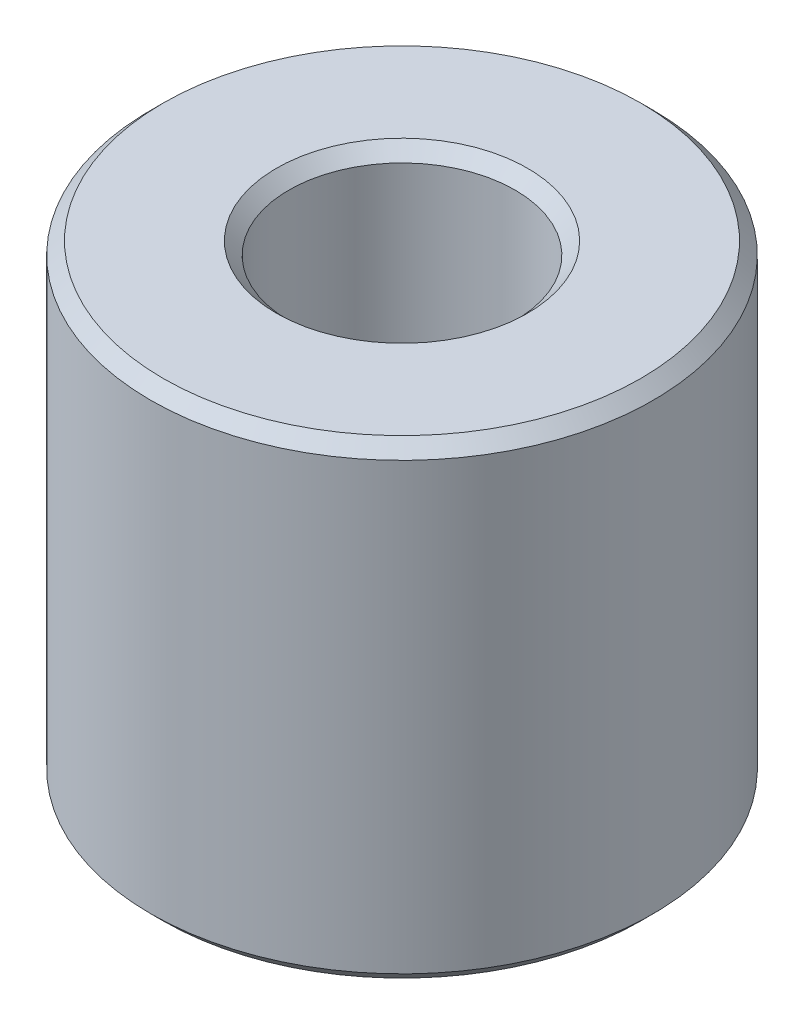
ISO-10303-21;
HEADER;
FILE_DESCRIPTION(('STEP AP214'),'2;1');
FILE_NAME('part.step','',(''),(''),'','','');
FILE_SCHEMA(('AUTOMOTIVE_DESIGN { 1 0 10303 214 1 1 1 1 }'));
ENDSEC;
DATA;
#1=APPLICATION_CONTEXT('core data for automotive mechanical design processes');
#2=APPLICATION_PROTOCOL_DEFINITION('international standard','automotive_design',2000,#1);
#3=PRODUCT_CONTEXT('',#1,'mechanical');
#4=PRODUCT('Part','Part','',(#3));
#5=PRODUCT_RELATED_PRODUCT_CATEGORY('part','',(#4));
#6=PRODUCT_DEFINITION_FORMATION('','',#4);
#7=PRODUCT_DEFINITION_CONTEXT('part definition',#1,'design');
#8=PRODUCT_DEFINITION('design','',#6,#7);
#9=PRODUCT_DEFINITION_SHAPE('','',#8);
#10=(LENGTH_UNIT() NAMED_UNIT(*) SI_UNIT(.MILLI.,.METRE.));
#11=(NAMED_UNIT(*) PLANE_ANGLE_UNIT() SI_UNIT($,.RADIAN.));
#12=(NAMED_UNIT(*) SI_UNIT($,.STERADIAN.) SOLID_ANGLE_UNIT());
#13=UNCERTAINTY_MEASURE_WITH_UNIT(LENGTH_MEASURE(1.E-05),#10,'distance_accuracy_value','');
#14=(GEOMETRIC_REPRESENTATION_CONTEXT(3) GLOBAL_UNCERTAINTY_ASSIGNED_CONTEXT((#13)) GLOBAL_UNIT_ASSIGNED_CONTEXT((#10,
#11,#12)) REPRESENTATION_CONTEXT('',''));
#15=CARTESIAN_POINT('',(0.,0.,0.));
#16=DIRECTION('',(0.,0.,1.));
#17=DIRECTION('',(1.,0.,0.));
#18=AXIS2_PLACEMENT_3D('',#15,#16,#17);
#19=CARTESIAN_POINT('',(0.,18.7,0.));
#20=DIRECTION('',(0.,1.,0.));
#21=DIRECTION('',(0.,0.,1.));
#22=AXIS2_PLACEMENT_3D('',#19,#20,#21);
#23=PLANE('',#22);
#24=CARTESIAN_POINT('',(0.,18.7,0.));
#25=DIRECTION('',(0.,1.,0.));
#26=DIRECTION('',(0.,0.,1.));
#27=AXIS2_PLACEMENT_3D('',#24,#25,#26);
#28=CIRCLE('',#27,9.49999999999999);
#29=CARTESIAN_POINT('',(0.,18.7,9.49999999999999));
#30=VERTEX_POINT('',#29);
#31=EDGE_CURVE('E59',#30,#30,#28,.T.);
#32=ORIENTED_EDGE('',*,*,#31,.T.);
#33=EDGE_LOOP('',(#32));
#34=FACE_BOUND('',#33,.T.);
#35=CARTESIAN_POINT('',(0.,18.7,0.));
#36=DIRECTION('',(0.,1.,0.));
#37=DIRECTION('',(0.,0.,1.));
#38=AXIS2_PLACEMENT_3D('',#35,#36,#37);
#39=CIRCLE('',#38,5.00000000000001);
#40=CARTESIAN_POINT('',(0.,18.7,5.00000000000001));
#41=VERTEX_POINT('',#40);
#42=EDGE_CURVE('E62',#41,#41,#39,.F.);
#43=ORIENTED_EDGE('',*,*,#42,.T.);
#44=EDGE_LOOP('',(#43));
#45=FACE_BOUND('',#44,.T.);
#46=ADVANCED_FACE('F33',(#34,#45),#23,.T.);
#47=CARTESIAN_POINT('',(0.,0.,0.));
#48=DIRECTION('',(0.,1.,0.));
#49=DIRECTION('',(0.,0.,1.));
#50=AXIS2_PLACEMENT_3D('',#47,#48,#49);
#51=PLANE('',#50);
#52=CARTESIAN_POINT('',(0.,0.,0.));
#53=DIRECTION('',(0.,1.,0.));
#54=DIRECTION('',(0.,0.,1.));
#55=AXIS2_PLACEMENT_3D('',#52,#53,#54);
#56=CIRCLE('',#55,4.99999999999999);
#57=CARTESIAN_POINT('',(0.,0.,4.99999999999999));
#58=VERTEX_POINT('',#57);
#59=EDGE_CURVE('E44',#58,#58,#56,.T.);
#60=ORIENTED_EDGE('',*,*,#59,.T.);
#61=EDGE_LOOP('',(#60));
#62=FACE_BOUND('',#61,.T.);
#63=CARTESIAN_POINT('',(0.,0.,0.));
#64=DIRECTION('',(0.,1.,0.));
#65=DIRECTION('',(0.,0.,1.));
#66=AXIS2_PLACEMENT_3D('',#63,#64,#65);
#67=CIRCLE('',#66,9.5);
#68=CARTESIAN_POINT('',(0.,0.,9.5));
#69=VERTEX_POINT('',#68);
#70=EDGE_CURVE('E48',#69,#69,#67,.F.);
#71=ORIENTED_EDGE('',*,*,#70,.T.);
#72=EDGE_LOOP('',(#71));
#73=FACE_BOUND('',#72,.T.);
#74=ADVANCED_FACE('F76',(#62,#73),#51,.F.);
#75=CARTESIAN_POINT('',(0.,18.7,0.));
#76=DIRECTION('',(0.,-1.,0.));
#77=DIRECTION('',(0.,0.,-1.));
#78=AXIS2_PLACEMENT_3D('',#75,#76,#77);
#79=CYLINDRICAL_SURFACE('',#78,10.);
#80=CARTESIAN_POINT('',(0.,18.2,0.));
#81=DIRECTION('',(0.,1.,0.));
#82=DIRECTION('',(0.,0.,1.));
#83=AXIS2_PLACEMENT_3D('',#80,#81,#82);
#84=CIRCLE('',#83,10.);
#85=CARTESIAN_POINT('',(0.,18.2,10.));
#86=VERTEX_POINT('',#85);
#87=EDGE_CURVE('E53',#86,#86,#84,.F.);
#88=ORIENTED_EDGE('',*,*,#87,.T.);
#89=EDGE_LOOP('',(#88));
#90=FACE_BOUND('',#89,.T.);
#91=CARTESIAN_POINT('',(0.,0.500000000000004,0.));
#92=DIRECTION('',(0.,1.,0.));
#93=DIRECTION('',(0.,0.,1.));
#94=AXIS2_PLACEMENT_3D('',#91,#92,#93);
#95=CIRCLE('',#94,10.);
#96=CARTESIAN_POINT('',(0.,0.500000000000004,10.));
#97=VERTEX_POINT('',#96);
#98=EDGE_CURVE('E56',#97,#97,#95,.T.);
#99=ORIENTED_EDGE('',*,*,#98,.T.);
#100=EDGE_LOOP('',(#99));
#101=FACE_BOUND('',#100,.T.);
#102=ADVANCED_FACE('F82',(#90,#101),#79,.T.);
#103=CARTESIAN_POINT('',(0.,18.7,0.));
#104=DIRECTION('',(0.,-1.,0.));
#105=DIRECTION('',(0.,0.,-1.));
#106=AXIS2_PLACEMENT_3D('',#103,#104,#105);
#107=CYLINDRICAL_SURFACE('',#106,4.5);
#108=CARTESIAN_POINT('',(0.,0.5,0.));
#109=DIRECTION('',(0.,1.,0.));
#110=DIRECTION('',(0.,0.,1.));
#111=AXIS2_PLACEMENT_3D('',#108,#109,#110);
#112=CIRCLE('',#111,4.5);
#113=CARTESIAN_POINT('',(0.,0.5,4.5));
#114=VERTEX_POINT('',#113);
#115=EDGE_CURVE('E10',#114,#114,#112,.F.);
#116=ORIENTED_EDGE('',*,*,#115,.T.);
#117=EDGE_LOOP('',(#116));
#118=FACE_BOUND('',#117,.T.);
#119=CARTESIAN_POINT('',(0.,18.2,0.));
#120=DIRECTION('',(0.,1.,0.));
#121=DIRECTION('',(0.,0.,1.));
#122=AXIS2_PLACEMENT_3D('',#119,#120,#121);
#123=CIRCLE('',#122,4.5);
#124=CARTESIAN_POINT('',(0.,18.2,4.5));
#125=VERTEX_POINT('',#124);
#126=EDGE_CURVE('E40',#125,#125,#123,.T.);
#127=ORIENTED_EDGE('',*,*,#126,.T.);
#128=EDGE_LOOP('',(#127));
#129=FACE_BOUND('',#128,.T.);
#130=ADVANCED_FACE('F86',(#118,#129),#107,.F.);
#131=CARTESIAN_POINT('',(0.,18.7,0.));
#132=DIRECTION('',(0.,-1.,0.));
#133=DIRECTION('',(0.,0.,-1.));
#134=AXIS2_PLACEMENT_3D('',#131,#132,#133);
#135=CONICAL_SURFACE('',#134,9.49999999999999,0.785398163397443);
#136=ORIENTED_EDGE('',*,*,#87,.F.);
#137=EDGE_LOOP('',(#136));
#138=FACE_BOUND('',#137,.T.);
#139=ORIENTED_EDGE('',*,*,#31,.F.);
#140=EDGE_LOOP('',(#139));
#141=FACE_BOUND('',#140,.T.);
#142=ADVANCED_FACE('F91',(#138,#141),#135,.T.);
#143=CARTESIAN_POINT('',(0.,0.,0.));
#144=DIRECTION('',(0.,-1.,0.));
#145=DIRECTION('',(0.,0.,-1.));
#146=AXIS2_PLACEMENT_3D('',#143,#144,#145);
#147=CONICAL_SURFACE('',#146,4.99999999999999,0.785398163397443);
#148=ORIENTED_EDGE('',*,*,#115,.F.);
#149=EDGE_LOOP('',(#148));
#150=FACE_BOUND('',#149,.T.);
#151=ORIENTED_EDGE('',*,*,#59,.F.);
#152=EDGE_LOOP('',(#151));
#153=FACE_BOUND('',#152,.T.);
#154=ADVANCED_FACE('F73',(#150,#153),#147,.F.);
#155=CARTESIAN_POINT('',(0.,0.500000000000004,0.));
#156=DIRECTION('',(0.,1.,0.));
#157=DIRECTION('',(0.,0.,1.));
#158=AXIS2_PLACEMENT_3D('',#155,#156,#157);
#159=CONICAL_SURFACE('',#158,10.,0.785398163397447);
#160=ORIENTED_EDGE('',*,*,#70,.F.);
#161=EDGE_LOOP('',(#160));
#162=FACE_BOUND('',#161,.T.);
#163=ORIENTED_EDGE('',*,*,#98,.F.);
#164=EDGE_LOOP('',(#163));
#165=FACE_BOUND('',#164,.T.);
#166=ADVANCED_FACE('F69',(#162,#165),#159,.T.);
#167=CARTESIAN_POINT('',(0.,18.2,0.));
#168=DIRECTION('',(0.,1.,0.));
#169=DIRECTION('',(0.,0.,1.));
#170=AXIS2_PLACEMENT_3D('',#167,#168,#169);
#171=CONICAL_SURFACE('',#170,4.5,0.785398163397453);
#172=ORIENTED_EDGE('',*,*,#42,.F.);
#173=EDGE_LOOP('',(#172));
#174=FACE_BOUND('',#173,.T.);
#175=ORIENTED_EDGE('',*,*,#126,.F.);
#176=EDGE_LOOP('',(#175));
#177=FACE_BOUND('',#176,.T.);
#178=ADVANCED_FACE('F35',(#174,#177),#171,.F.);
#179=CLOSED_SHELL('',(#46,#74,#102,#130,#142,#154,#166,#178));
#180=MANIFOLD_SOLID_BREP('B2',#179);
#181=ADVANCED_BREP_SHAPE_REPRESENTATION('',(#18,#180),#14);
#182=SHAPE_DEFINITION_REPRESENTATION(#9,#181);
ENDSEC;
END-ISO-10303-21;
